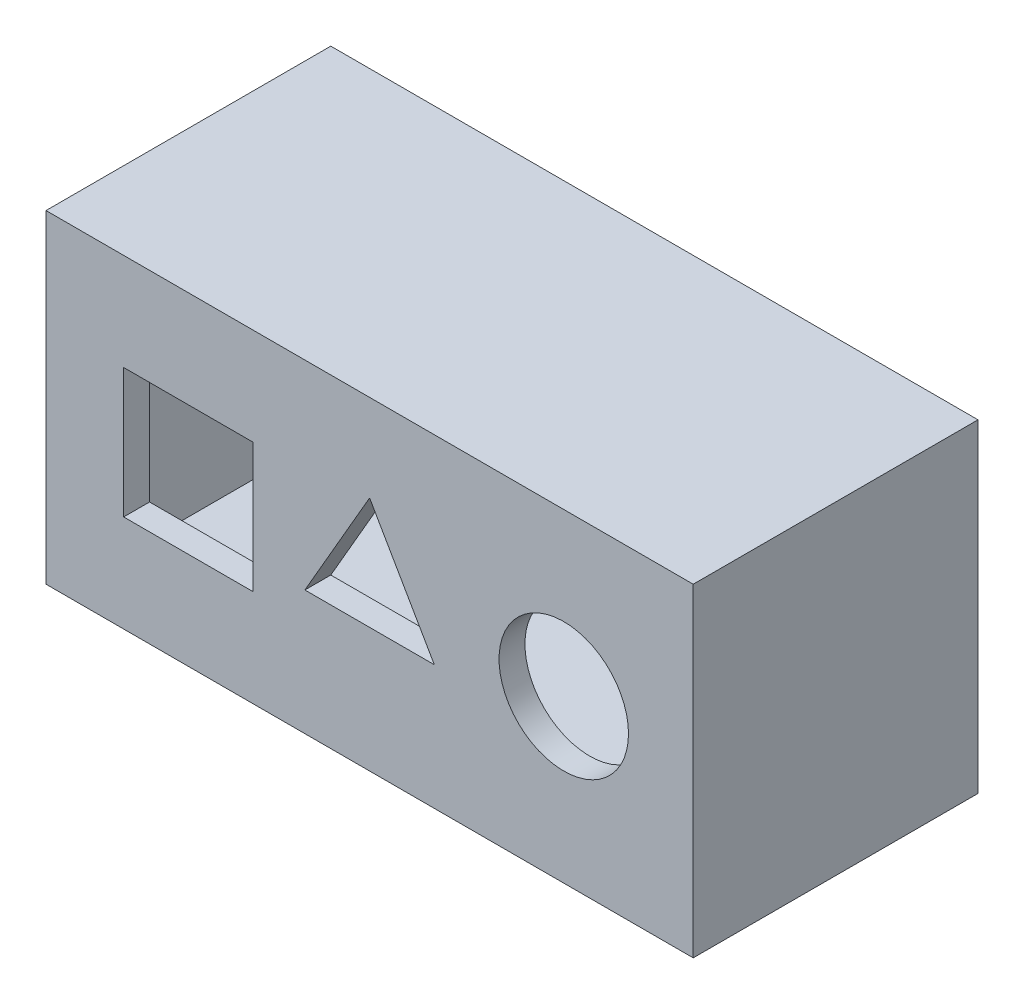
ISO-10303-21;
HEADER;
FILE_DESCRIPTION(('STEP AP214'),'2;1');
FILE_NAME('part.step','',(''),(''),'','','');
FILE_SCHEMA(('AUTOMOTIVE_DESIGN { 1 0 10303 214 1 1 1 1 }'));
ENDSEC;
DATA;
#1=APPLICATION_CONTEXT('core data for automotive mechanical design processes');
#2=APPLICATION_PROTOCOL_DEFINITION('international standard','automotive_design',2000,#1);
#3=PRODUCT_CONTEXT('',#1,'mechanical');
#4=PRODUCT('Part','Part','',(#3));
#5=PRODUCT_RELATED_PRODUCT_CATEGORY('part','',(#4));
#6=PRODUCT_DEFINITION_FORMATION('','',#4);
#7=PRODUCT_DEFINITION_CONTEXT('part definition',#1,'design');
#8=PRODUCT_DEFINITION('design','',#6,#7);
#9=PRODUCT_DEFINITION_SHAPE('','',#8);
#10=(LENGTH_UNIT() NAMED_UNIT(*) SI_UNIT(.MILLI.,.METRE.));
#11=(NAMED_UNIT(*) PLANE_ANGLE_UNIT() SI_UNIT($,.RADIAN.));
#12=(NAMED_UNIT(*) SI_UNIT($,.STERADIAN.) SOLID_ANGLE_UNIT());
#13=UNCERTAINTY_MEASURE_WITH_UNIT(LENGTH_MEASURE(1.E-05),#10,'distance_accuracy_value','');
#14=(GEOMETRIC_REPRESENTATION_CONTEXT(3) GLOBAL_UNCERTAINTY_ASSIGNED_CONTEXT((#13)) GLOBAL_UNIT_ASSIGNED_CONTEXT((#10,
#11,#12)) REPRESENTATION_CONTEXT('',''));
#15=CARTESIAN_POINT('',(0.,0.,0.));
#16=DIRECTION('',(0.,0.,1.));
#17=DIRECTION('',(1.,0.,0.));
#18=AXIS2_PLACEMENT_3D('',#15,#16,#17);
#19=CARTESIAN_POINT('',(0.,0.,0.));
#20=DIRECTION('',(0.,0.,1.));
#21=DIRECTION('',(1.,0.,0.));
#22=AXIS2_PLACEMENT_3D('',#19,#20,#21);
#23=PLANE('',#22);
#24=DIRECTION('',(0.,-1.,0.));
#25=VECTOR('',#24,1.);
#26=CARTESIAN_POINT('',(-125.,-62.5,0.));
#27=LINE('',#26,#25);
#28=CARTESIAN_POINT('',(-125.,62.5,0.));
#29=VERTEX_POINT('',#28);
#30=CARTESIAN_POINT('',(-125.,-62.5,0.));
#31=VERTEX_POINT('',#30);
#32=EDGE_CURVE('E234',#29,#31,#27,.T.);
#33=ORIENTED_EDGE('',*,*,#32,.F.);
#34=DIRECTION('',(-1.,0.,0.));
#35=VECTOR('',#34,1.);
#36=CARTESIAN_POINT('',(125.,62.5,0.));
#37=LINE('',#36,#35);
#38=CARTESIAN_POINT('',(125.,62.5,0.));
#39=VERTEX_POINT('',#38);
#40=EDGE_CURVE('E244',#39,#29,#37,.T.);
#41=ORIENTED_EDGE('',*,*,#40,.F.);
#42=DIRECTION('',(0.,1.,0.));
#43=VECTOR('',#42,1.);
#44=CARTESIAN_POINT('',(125.,-62.5,0.));
#45=LINE('',#44,#43);
#46=CARTESIAN_POINT('',(125.,-62.5,0.));
#47=VERTEX_POINT('',#46);
#48=EDGE_CURVE('E241',#47,#39,#45,.T.);
#49=ORIENTED_EDGE('',*,*,#48,.F.);
#50=DIRECTION('',(1.,0.,0.));
#51=VECTOR('',#50,1.);
#52=CARTESIAN_POINT('',(125.,-62.5,0.));
#53=LINE('',#52,#51);
#54=EDGE_CURVE('E238',#31,#47,#53,.T.);
#55=ORIENTED_EDGE('',*,*,#54,.F.);
#56=EDGE_LOOP('',(#33,#41,#49,#55));
#57=FACE_BOUND('',#56,.T.);
#58=DIRECTION('',(0.,-1.,0.));
#59=VECTOR('',#58,1.);
#60=CARTESIAN_POINT('',(-115.,-57.5,0.));
#61=LINE('',#60,#59);
#62=CARTESIAN_POINT('',(-115.,57.5,0.));
#63=VERTEX_POINT('',#62);
#64=CARTESIAN_POINT('',(-115.,-57.5,0.));
#65=VERTEX_POINT('',#64);
#66=EDGE_CURVE('E67',#63,#65,#61,.T.);
#67=ORIENTED_EDGE('',*,*,#66,.T.);
#68=DIRECTION('',(1.,0.,0.));
#69=VECTOR('',#68,1.);
#70=CARTESIAN_POINT('',(115.,-57.5,0.));
#71=LINE('',#70,#69);
#72=CARTESIAN_POINT('',(115.,-57.5,0.));
#73=VERTEX_POINT('',#72);
#74=EDGE_CURVE('E211',#65,#73,#71,.T.);
#75=ORIENTED_EDGE('',*,*,#74,.T.);
#76=DIRECTION('',(0.,1.,0.));
#77=VECTOR('',#76,1.);
#78=CARTESIAN_POINT('',(115.,-57.5,0.));
#79=LINE('',#78,#77);
#80=CARTESIAN_POINT('',(115.,57.5,0.));
#81=VERTEX_POINT('',#80);
#82=EDGE_CURVE('E216',#73,#81,#79,.T.);
#83=ORIENTED_EDGE('',*,*,#82,.T.);
#84=DIRECTION('',(-1.,0.,0.));
#85=VECTOR('',#84,1.);
#86=CARTESIAN_POINT('',(115.,57.5,0.));
#87=LINE('',#86,#85);
#88=EDGE_CURVE('E198',#81,#63,#87,.T.);
#89=ORIENTED_EDGE('',*,*,#88,.T.);
#90=EDGE_LOOP('',(#67,#75,#83,#89));
#91=FACE_BOUND('',#90,.T.);
#92=ADVANCED_FACE('F43',(#57,#91),#23,.F.);
#93=CARTESIAN_POINT('',(-125.,-62.5,100.));
#94=DIRECTION('',(1.,0.,0.));
#95=DIRECTION('',(0.,0.,-1.));
#96=AXIS2_PLACEMENT_3D('',#93,#94,#95);
#97=PLANE('',#96);
#98=ORIENTED_EDGE('',*,*,#32,.T.);
#99=DIRECTION('',(0.,0.,-1.));
#100=VECTOR('',#99,1.);
#101=CARTESIAN_POINT('',(-125.,-62.5,100.));
#102=LINE('',#101,#100);
#103=CARTESIAN_POINT('',(-125.,-62.5,110.));
#104=VERTEX_POINT('',#103);
#105=EDGE_CURVE('E11',#104,#31,#102,.T.);
#106=ORIENTED_EDGE('',*,*,#105,.F.);
#107=DIRECTION('',(0.,-1.,0.));
#108=VECTOR('',#107,1.);
#109=CARTESIAN_POINT('',(-125.,0.,110.));
#110=LINE('',#109,#108);
#111=CARTESIAN_POINT('',(-125.,62.5,110.));
#112=VERTEX_POINT('',#111);
#113=EDGE_CURVE('E275',#112,#104,#110,.T.);
#114=ORIENTED_EDGE('',*,*,#113,.F.);
#115=DIRECTION('',(0.,0.,-1.));
#116=VECTOR('',#115,1.);
#117=CARTESIAN_POINT('',(-125.,62.5,100.));
#118=LINE('',#117,#116);
#119=EDGE_CURVE('E247',#112,#29,#118,.T.);
#120=ORIENTED_EDGE('',*,*,#119,.T.);
#121=EDGE_LOOP('',(#98,#106,#114,#120));
#122=FACE_BOUND('',#121,.T.);
#123=ADVANCED_FACE('F45',(#122),#97,.F.);
#124=CARTESIAN_POINT('',(125.,-62.5,100.));
#125=DIRECTION('',(0.,1.,0.));
#126=DIRECTION('',(-1.,0.,0.));
#127=AXIS2_PLACEMENT_3D('',#124,#125,#126);
#128=PLANE('',#127);
#129=ORIENTED_EDGE('',*,*,#54,.T.);
#130=DIRECTION('',(0.,0.,-1.));
#131=VECTOR('',#130,1.);
#132=CARTESIAN_POINT('',(125.,-62.5,100.));
#133=LINE('',#132,#131);
#134=CARTESIAN_POINT('',(125.,-62.5,110.));
#135=VERTEX_POINT('',#134);
#136=EDGE_CURVE('E52',#135,#47,#133,.T.);
#137=ORIENTED_EDGE('',*,*,#136,.F.);
#138=DIRECTION('',(1.,0.,0.));
#139=VECTOR('',#138,1.);
#140=CARTESIAN_POINT('',(0.,-62.5,110.));
#141=LINE('',#140,#139);
#142=EDGE_CURVE('E279',#104,#135,#141,.T.);
#143=ORIENTED_EDGE('',*,*,#142,.F.);
#144=ORIENTED_EDGE('',*,*,#105,.T.);
#145=EDGE_LOOP('',(#129,#137,#143,#144));
#146=FACE_BOUND('',#145,.T.);
#147=ADVANCED_FACE('F382',(#146),#128,.F.);
#148=CARTESIAN_POINT('',(125.,-62.5,100.));
#149=DIRECTION('',(-1.,0.,0.));
#150=DIRECTION('',(0.,0.,1.));
#151=AXIS2_PLACEMENT_3D('',#148,#149,#150);
#152=PLANE('',#151);
#153=ORIENTED_EDGE('',*,*,#48,.T.);
#154=DIRECTION('',(0.,0.,-1.));
#155=VECTOR('',#154,1.);
#156=CARTESIAN_POINT('',(125.,62.5,100.));
#157=LINE('',#156,#155);
#158=CARTESIAN_POINT('',(125.,62.5,110.));
#159=VERTEX_POINT('',#158);
#160=EDGE_CURVE('E251',#159,#39,#157,.T.);
#161=ORIENTED_EDGE('',*,*,#160,.F.);
#162=DIRECTION('',(0.,1.,0.));
#163=VECTOR('',#162,1.);
#164=CARTESIAN_POINT('',(125.,0.,110.));
#165=LINE('',#164,#163);
#166=EDGE_CURVE('E261',#135,#159,#165,.T.);
#167=ORIENTED_EDGE('',*,*,#166,.F.);
#168=ORIENTED_EDGE('',*,*,#136,.T.);
#169=EDGE_LOOP('',(#153,#161,#167,#168));
#170=FACE_BOUND('',#169,.T.);
#171=ADVANCED_FACE('F259',(#170),#152,.F.);
#172=CARTESIAN_POINT('',(125.,62.5,100.));
#173=DIRECTION('',(0.,-1.,0.));
#174=DIRECTION('',(1.,0.,0.));
#175=AXIS2_PLACEMENT_3D('',#172,#173,#174);
#176=PLANE('',#175);
#177=ORIENTED_EDGE('',*,*,#40,.T.);
#178=ORIENTED_EDGE('',*,*,#119,.F.);
#179=DIRECTION('',(-1.,0.,0.));
#180=VECTOR('',#179,1.);
#181=CARTESIAN_POINT('',(0.,62.5,110.));
#182=LINE('',#181,#180);
#183=EDGE_CURVE('E280',#159,#112,#182,.T.);
#184=ORIENTED_EDGE('',*,*,#183,.F.);
#185=ORIENTED_EDGE('',*,*,#160,.T.);
#186=EDGE_LOOP('',(#177,#178,#184,#185));
#187=FACE_BOUND('',#186,.T.);
#188=ADVANCED_FACE('F270',(#187),#176,.F.);
#189=CARTESIAN_POINT('',(-115.,-57.5,100.));
#190=DIRECTION('',(1.,0.,0.));
#191=DIRECTION('',(0.,0.,-1.));
#192=AXIS2_PLACEMENT_3D('',#189,#190,#191);
#193=PLANE('',#192);
#194=ORIENTED_EDGE('',*,*,#66,.F.);
#195=DIRECTION('',(0.,0.,-1.));
#196=VECTOR('',#195,1.);
#197=CARTESIAN_POINT('',(-115.,57.5,100.));
#198=LINE('',#197,#196);
#199=CARTESIAN_POINT('',(-115.,57.5,100.));
#200=VERTEX_POINT('',#199);
#201=EDGE_CURVE('E208',#200,#63,#198,.T.);
#202=ORIENTED_EDGE('',*,*,#201,.F.);
#203=DIRECTION('',(0.,-1.,0.));
#204=VECTOR('',#203,1.);
#205=CARTESIAN_POINT('',(-115.,-57.5,100.));
#206=LINE('',#205,#204);
#207=CARTESIAN_POINT('',(-115.,-57.5,100.));
#208=VERTEX_POINT('',#207);
#209=EDGE_CURVE('E193',#200,#208,#206,.T.);
#210=ORIENTED_EDGE('',*,*,#209,.T.);
#211=DIRECTION('',(0.,0.,-1.));
#212=VECTOR('',#211,1.);
#213=CARTESIAN_POINT('',(-115.,-57.5,100.));
#214=LINE('',#213,#212);
#215=EDGE_CURVE('E231',#208,#65,#214,.T.);
#216=ORIENTED_EDGE('',*,*,#215,.T.);
#217=EDGE_LOOP('',(#194,#202,#210,#216));
#218=FACE_BOUND('',#217,.T.);
#219=ADVANCED_FACE('F385',(#218),#193,.T.);
#220=CARTESIAN_POINT('',(115.,-57.5,100.));
#221=DIRECTION('',(0.,1.,0.));
#222=DIRECTION('',(0.,0.,1.));
#223=AXIS2_PLACEMENT_3D('',#220,#221,#222);
#224=PLANE('',#223);
#225=ORIENTED_EDGE('',*,*,#74,.F.);
#226=ORIENTED_EDGE('',*,*,#215,.F.);
#227=DIRECTION('',(1.,0.,0.));
#228=VECTOR('',#227,1.);
#229=CARTESIAN_POINT('',(115.,-57.5,100.));
#230=LINE('',#229,#228);
#231=CARTESIAN_POINT('',(115.,-57.5,100.));
#232=VERTEX_POINT('',#231);
#233=EDGE_CURVE('E197',#208,#232,#230,.T.);
#234=ORIENTED_EDGE('',*,*,#233,.T.);
#235=DIRECTION('',(0.,0.,-1.));
#236=VECTOR('',#235,1.);
#237=CARTESIAN_POINT('',(115.,-57.5,100.));
#238=LINE('',#237,#236);
#239=EDGE_CURVE('E228',#232,#73,#238,.T.);
#240=ORIENTED_EDGE('',*,*,#239,.T.);
#241=EDGE_LOOP('',(#225,#226,#234,#240));
#242=FACE_BOUND('',#241,.T.);
#243=ADVANCED_FACE('F409',(#242),#224,.T.);
#244=CARTESIAN_POINT('',(115.,-57.5,100.));
#245=DIRECTION('',(-1.,0.,0.));
#246=DIRECTION('',(0.,0.,1.));
#247=AXIS2_PLACEMENT_3D('',#244,#245,#246);
#248=PLANE('',#247);
#249=ORIENTED_EDGE('',*,*,#82,.F.);
#250=ORIENTED_EDGE('',*,*,#239,.F.);
#251=DIRECTION('',(0.,1.,0.));
#252=VECTOR('',#251,1.);
#253=CARTESIAN_POINT('',(115.,-57.5,100.));
#254=LINE('',#253,#252);
#255=CARTESIAN_POINT('',(115.,57.5,100.));
#256=VERTEX_POINT('',#255);
#257=EDGE_CURVE('E202',#232,#256,#254,.T.);
#258=ORIENTED_EDGE('',*,*,#257,.T.);
#259=DIRECTION('',(0.,0.,-1.));
#260=VECTOR('',#259,1.);
#261=CARTESIAN_POINT('',(115.,57.5,100.));
#262=LINE('',#261,#260);
#263=EDGE_CURVE('E225',#256,#81,#262,.T.);
#264=ORIENTED_EDGE('',*,*,#263,.T.);
#265=EDGE_LOOP('',(#249,#250,#258,#264));
#266=FACE_BOUND('',#265,.T.);
#267=ADVANCED_FACE('F415',(#266),#248,.T.);
#268=CARTESIAN_POINT('',(115.,57.5,100.));
#269=DIRECTION('',(0.,-1.,0.));
#270=DIRECTION('',(0.,0.,-1.));
#271=AXIS2_PLACEMENT_3D('',#268,#269,#270);
#272=PLANE('',#271);
#273=ORIENTED_EDGE('',*,*,#88,.F.);
#274=ORIENTED_EDGE('',*,*,#263,.F.);
#275=DIRECTION('',(-1.,0.,0.));
#276=VECTOR('',#275,1.);
#277=CARTESIAN_POINT('',(115.,57.5,100.));
#278=LINE('',#277,#276);
#279=EDGE_CURVE('E59',#256,#200,#278,.T.);
#280=ORIENTED_EDGE('',*,*,#279,.T.);
#281=ORIENTED_EDGE('',*,*,#201,.T.);
#282=EDGE_LOOP('',(#273,#274,#280,#281));
#283=FACE_BOUND('',#282,.T.);
#284=ADVANCED_FACE('F422',(#283),#272,.T.);
#285=CARTESIAN_POINT('',(12.5,7.21687836487032,110.));
#286=DIRECTION('',(0.866025403784439,0.5,0.));
#287=DIRECTION('',(-0.5,0.866025403784439,0.));
#288=AXIS2_PLACEMENT_3D('',#285,#286,#287);
#289=PLANE('',#288);
#290=DIRECTION('',(0.5,-0.866025403784439,0.));
#291=VECTOR('',#290,1.);
#292=CARTESIAN_POINT('',(12.5,7.21687836487032,100.));
#293=LINE('',#292,#291);
#294=CARTESIAN_POINT('',(0.,28.8675134594813,100.));
#295=VERTEX_POINT('',#294);
#296=CARTESIAN_POINT('',(25.,-14.4337567297406,100.));
#297=VERTEX_POINT('',#296);
#298=EDGE_CURVE('E312',#295,#297,#293,.T.);
#299=ORIENTED_EDGE('',*,*,#298,.T.);
#300=DIRECTION('',(0.,0.,-1.));
#301=VECTOR('',#300,1.);
#302=CARTESIAN_POINT('',(25.,-14.4337567297406,110.));
#303=LINE('',#302,#301);
#304=CARTESIAN_POINT('',(25.,-14.4337567297406,110.));
#305=VERTEX_POINT('',#304);
#306=EDGE_CURVE('E212',#305,#297,#303,.T.);
#307=ORIENTED_EDGE('',*,*,#306,.F.);
#308=DIRECTION('',(0.5,-0.866025403784439,0.));
#309=VECTOR('',#308,1.);
#310=CARTESIAN_POINT('',(12.5,7.21687836487032,110.));
#311=LINE('',#310,#309);
#312=CARTESIAN_POINT('',(0.,28.8675134594813,110.));
#313=VERTEX_POINT('',#312);
#314=EDGE_CURVE('E349',#313,#305,#311,.T.);
#315=ORIENTED_EDGE('',*,*,#314,.F.);
#316=DIRECTION('',(0.,0.,-1.));
#317=VECTOR('',#316,1.);
#318=CARTESIAN_POINT('',(0.,28.8675134594813,110.));
#319=LINE('',#318,#317);
#320=EDGE_CURVE('E182',#313,#295,#319,.T.);
#321=ORIENTED_EDGE('',*,*,#320,.T.);
#322=EDGE_LOOP('',(#299,#307,#315,#321));
#323=FACE_BOUND('',#322,.T.);
#324=ADVANCED_FACE('F345',(#323),#289,.F.);
#325=CARTESIAN_POINT('',(0.,-14.4337567297406,110.));
#326=DIRECTION('',(0.,-1.,0.));
#327=DIRECTION('',(1.,0.,0.));
#328=AXIS2_PLACEMENT_3D('',#325,#326,#327);
#329=PLANE('',#328);
#330=DIRECTION('',(-1.,0.,0.));
#331=VECTOR('',#330,1.);
#332=CARTESIAN_POINT('',(0.,-14.4337567297406,100.));
#333=LINE('',#332,#331);
#334=CARTESIAN_POINT('',(-25.,-14.4337567297406,100.));
#335=VERTEX_POINT('',#334);
#336=EDGE_CURVE('E316',#297,#335,#333,.T.);
#337=ORIENTED_EDGE('',*,*,#336,.T.);
#338=DIRECTION('',(0.,0.,-1.));
#339=VECTOR('',#338,1.);
#340=CARTESIAN_POINT('',(-25.,-14.4337567297406,110.));
#341=LINE('',#340,#339);
#342=CARTESIAN_POINT('',(-25.,-14.4337567297406,110.));
#343=VERTEX_POINT('',#342);
#344=EDGE_CURVE('E187',#343,#335,#341,.T.);
#345=ORIENTED_EDGE('',*,*,#344,.F.);
#346=DIRECTION('',(-1.,0.,0.));
#347=VECTOR('',#346,1.);
#348=CARTESIAN_POINT('',(0.,-14.4337567297406,110.));
#349=LINE('',#348,#347);
#350=EDGE_CURVE('E286',#305,#343,#349,.T.);
#351=ORIENTED_EDGE('',*,*,#350,.F.);
#352=ORIENTED_EDGE('',*,*,#306,.T.);
#353=EDGE_LOOP('',(#337,#345,#351,#352));
#354=FACE_BOUND('',#353,.T.);
#355=ADVANCED_FACE('F355',(#354),#329,.F.);
#356=CARTESIAN_POINT('',(0.,25.,110.));
#357=DIRECTION('',(0.,1.,0.));
#358=DIRECTION('',(0.,0.,1.));
#359=AXIS2_PLACEMENT_3D('',#356,#357,#358);
#360=PLANE('',#359);
#361=DIRECTION('',(1.,0.,0.));
#362=VECTOR('',#361,1.);
#363=CARTESIAN_POINT('',(0.,25.,100.));
#364=LINE('',#363,#362);
#365=CARTESIAN_POINT('',(-95.,25.,100.));
#366=VERTEX_POINT('',#365);
#367=CARTESIAN_POINT('',(-45.,25.,100.));
#368=VERTEX_POINT('',#367);
#369=EDGE_CURVE('E180',#366,#368,#364,.T.);
#370=ORIENTED_EDGE('',*,*,#369,.T.);
#371=DIRECTION('',(0.,0.,-1.));
#372=VECTOR('',#371,1.);
#373=CARTESIAN_POINT('',(-45.,25.,110.));
#374=LINE('',#373,#372);
#375=CARTESIAN_POINT('',(-45.,25.,110.));
#376=VERTEX_POINT('',#375);
#377=EDGE_CURVE('E158',#376,#368,#374,.T.);
#378=ORIENTED_EDGE('',*,*,#377,.F.);
#379=DIRECTION('',(1.,0.,0.));
#380=VECTOR('',#379,1.);
#381=CARTESIAN_POINT('',(0.,25.,110.));
#382=LINE('',#381,#380);
#383=CARTESIAN_POINT('',(-95.,25.,110.));
#384=VERTEX_POINT('',#383);
#385=EDGE_CURVE('E166',#384,#376,#382,.T.);
#386=ORIENTED_EDGE('',*,*,#385,.F.);
#387=DIRECTION('',(0.,0.,-1.));
#388=VECTOR('',#387,1.);
#389=CARTESIAN_POINT('',(-95.,25.,110.));
#390=LINE('',#389,#388);
#391=EDGE_CURVE('E294',#384,#366,#390,.T.);
#392=ORIENTED_EDGE('',*,*,#391,.T.);
#393=EDGE_LOOP('',(#370,#378,#386,#392));
#394=FACE_BOUND('',#393,.T.);
#395=ADVANCED_FACE('F178',(#394),#360,.F.);
#396=CARTESIAN_POINT('',(-45.,0.,110.));
#397=DIRECTION('',(1.,0.,0.));
#398=DIRECTION('',(0.,1.,0.));
#399=AXIS2_PLACEMENT_3D('',#396,#397,#398);
#400=PLANE('',#399);
#401=DIRECTION('',(0.,-1.,0.));
#402=VECTOR('',#401,1.);
#403=CARTESIAN_POINT('',(-45.,0.,100.));
#404=LINE('',#403,#402);
#405=CARTESIAN_POINT('',(-45.,-25.,100.));
#406=VERTEX_POINT('',#405);
#407=EDGE_CURVE('E301',#368,#406,#404,.T.);
#408=ORIENTED_EDGE('',*,*,#407,.T.);
#409=DIRECTION('',(0.,0.,-1.));
#410=VECTOR('',#409,1.);
#411=CARTESIAN_POINT('',(-45.,-25.,110.));
#412=LINE('',#411,#410);
#413=CARTESIAN_POINT('',(-45.,-25.,110.));
#414=VERTEX_POINT('',#413);
#415=EDGE_CURVE('E160',#414,#406,#412,.T.);
#416=ORIENTED_EDGE('',*,*,#415,.F.);
#417=DIRECTION('',(0.,-1.,0.));
#418=VECTOR('',#417,1.);
#419=CARTESIAN_POINT('',(-45.,0.,110.));
#420=LINE('',#419,#418);
#421=EDGE_CURVE('E153',#376,#414,#420,.T.);
#422=ORIENTED_EDGE('',*,*,#421,.F.);
#423=ORIENTED_EDGE('',*,*,#377,.T.);
#424=EDGE_LOOP('',(#408,#416,#422,#423));
#425=FACE_BOUND('',#424,.T.);
#426=ADVANCED_FACE('F156',(#425),#400,.F.);
#427=CARTESIAN_POINT('',(0.,-25.,110.));
#428=DIRECTION('',(0.,1.,0.));
#429=DIRECTION('',(0.,0.,1.));
#430=AXIS2_PLACEMENT_3D('',#427,#428,#429);
#431=PLANE('',#430);
#432=DIRECTION('',(1.,0.,0.));
#433=VECTOR('',#432,1.);
#434=CARTESIAN_POINT('',(0.,-25.,100.));
#435=LINE('',#434,#433);
#436=CARTESIAN_POINT('',(-95.,-25.,100.));
#437=VERTEX_POINT('',#436);
#438=EDGE_CURVE('E304',#437,#406,#435,.T.);
#439=ORIENTED_EDGE('',*,*,#438,.F.);
#440=DIRECTION('',(0.,0.,-1.));
#441=VECTOR('',#440,1.);
#442=CARTESIAN_POINT('',(-95.,-25.,110.));
#443=LINE('',#442,#441);
#444=CARTESIAN_POINT('',(-95.,-25.,110.));
#445=VERTEX_POINT('',#444);
#446=EDGE_CURVE('E189',#445,#437,#443,.T.);
#447=ORIENTED_EDGE('',*,*,#446,.F.);
#448=DIRECTION('',(1.,0.,0.));
#449=VECTOR('',#448,1.);
#450=CARTESIAN_POINT('',(0.,-25.,110.));
#451=LINE('',#450,#449);
#452=EDGE_CURVE('E165',#445,#414,#451,.T.);
#453=ORIENTED_EDGE('',*,*,#452,.T.);
#454=ORIENTED_EDGE('',*,*,#415,.T.);
#455=EDGE_LOOP('',(#439,#447,#453,#454));
#456=FACE_BOUND('',#455,.T.);
#457=ADVANCED_FACE('F335',(#456),#431,.T.);
#458=CARTESIAN_POINT('',(-12.5,7.21687836487033,110.));
#459=DIRECTION('',(-0.866025403784439,0.5,0.));
#460=DIRECTION('',(-0.5,-0.866025403784439,0.));
#461=AXIS2_PLACEMENT_3D('',#458,#459,#460);
#462=PLANE('',#461);
#463=DIRECTION('',(0.5,0.866025403784439,0.));
#464=VECTOR('',#463,1.);
#465=CARTESIAN_POINT('',(-12.5,7.21687836487033,100.));
#466=LINE('',#465,#464);
#467=EDGE_CURVE('E319',#335,#295,#466,.T.);
#468=ORIENTED_EDGE('',*,*,#467,.T.);
#469=ORIENTED_EDGE('',*,*,#320,.F.);
#470=DIRECTION('',(0.5,0.866025403784439,0.));
#471=VECTOR('',#470,1.);
#472=CARTESIAN_POINT('',(-12.5,7.21687836487033,110.));
#473=LINE('',#472,#471);
#474=EDGE_CURVE('E283',#343,#313,#473,.T.);
#475=ORIENTED_EDGE('',*,*,#474,.F.);
#476=ORIENTED_EDGE('',*,*,#344,.T.);
#477=EDGE_LOOP('',(#468,#469,#475,#476));
#478=FACE_BOUND('',#477,.T.);
#479=ADVANCED_FACE('F352',(#478),#462,.F.);
#480=CARTESIAN_POINT('',(-95.,0.,110.));
#481=DIRECTION('',(1.,0.,0.));
#482=DIRECTION('',(0.,0.,-1.));
#483=AXIS2_PLACEMENT_3D('',#480,#481,#482);
#484=PLANE('',#483);
#485=DIRECTION('',(0.,-1.,0.));
#486=VECTOR('',#485,1.);
#487=CARTESIAN_POINT('',(-95.,0.,100.));
#488=LINE('',#487,#486);
#489=EDGE_CURVE('E308',#366,#437,#488,.T.);
#490=ORIENTED_EDGE('',*,*,#489,.F.);
#491=ORIENTED_EDGE('',*,*,#391,.F.);
#492=DIRECTION('',(0.,-1.,0.));
#493=VECTOR('',#492,1.);
#494=CARTESIAN_POINT('',(-95.,0.,110.));
#495=LINE('',#494,#493);
#496=EDGE_CURVE('E173',#384,#445,#495,.T.);
#497=ORIENTED_EDGE('',*,*,#496,.T.);
#498=ORIENTED_EDGE('',*,*,#446,.T.);
#499=EDGE_LOOP('',(#490,#491,#497,#498));
#500=FACE_BOUND('',#499,.T.);
#501=ADVANCED_FACE('F333',(#500),#484,.T.);
#502=CARTESIAN_POINT('',(74.9999999999999,0.,110.));
#503=DIRECTION('',(0.,0.,-1.));
#504=DIRECTION('',(-1.,0.,0.));
#505=AXIS2_PLACEMENT_3D('',#502,#503,#504);
#506=CYLINDRICAL_SURFACE('',#505,25.);
#507=CARTESIAN_POINT('',(74.9999999999999,0.,110.));
#508=DIRECTION('',(0.,0.,1.));
#509=DIRECTION('',(1.,0.,0.));
#510=AXIS2_PLACEMENT_3D('',#507,#508,#509);
#511=CIRCLE('',#510,25.);
#512=CARTESIAN_POINT('',(99.9999999999999,0.,110.));
#513=VERTEX_POINT('',#512);
#514=EDGE_CURVE('E176',#513,#513,#511,.T.);
#515=ORIENTED_EDGE('',*,*,#514,.T.);
#516=EDGE_LOOP('',(#515));
#517=FACE_BOUND('',#516,.T.);
#518=CARTESIAN_POINT('',(74.9999999999999,0.,100.));
#519=DIRECTION('',(0.,0.,1.));
#520=DIRECTION('',(1.,0.,0.));
#521=AXIS2_PLACEMENT_3D('',#518,#519,#520);
#522=CIRCLE('',#521,25.);
#523=CARTESIAN_POINT('',(99.9999999999999,0.,100.));
#524=VERTEX_POINT('',#523);
#525=EDGE_CURVE('E295',#524,#524,#522,.T.);
#526=ORIENTED_EDGE('',*,*,#525,.F.);
#527=EDGE_LOOP('',(#526));
#528=FACE_BOUND('',#527,.T.);
#529=ADVANCED_FACE('F368',(#517,#528),#506,.F.);
#530=CARTESIAN_POINT('',(0.,0.,110.));
#531=DIRECTION('',(0.,0.,1.));
#532=DIRECTION('',(1.,0.,0.));
#533=AXIS2_PLACEMENT_3D('',#530,#531,#532);
#534=PLANE('',#533);
#535=ORIENTED_EDGE('',*,*,#514,.F.);
#536=EDGE_LOOP('',(#535));
#537=FACE_BOUND('',#536,.T.);
#538=ORIENTED_EDGE('',*,*,#385,.T.);
#539=ORIENTED_EDGE('',*,*,#421,.T.);
#540=ORIENTED_EDGE('',*,*,#452,.F.);
#541=ORIENTED_EDGE('',*,*,#496,.F.);
#542=EDGE_LOOP('',(#538,#539,#540,#541));
#543=FACE_BOUND('',#542,.T.);
#544=ORIENTED_EDGE('',*,*,#314,.T.);
#545=ORIENTED_EDGE('',*,*,#350,.T.);
#546=ORIENTED_EDGE('',*,*,#474,.T.);
#547=EDGE_LOOP('',(#544,#545,#546));
#548=FACE_BOUND('',#547,.T.);
#549=ORIENTED_EDGE('',*,*,#183,.T.);
#550=ORIENTED_EDGE('',*,*,#113,.T.);
#551=ORIENTED_EDGE('',*,*,#142,.T.);
#552=ORIENTED_EDGE('',*,*,#166,.T.);
#553=EDGE_LOOP('',(#549,#550,#551,#552));
#554=FACE_BOUND('',#553,.T.);
#555=ADVANCED_FACE('F170',(#537,#543,#548,#554),#534,.T.);
#556=CARTESIAN_POINT('',(0.,0.,100.));
#557=DIRECTION('',(0.,0.,1.));
#558=DIRECTION('',(1.,0.,0.));
#559=AXIS2_PLACEMENT_3D('',#556,#557,#558);
#560=PLANE('',#559);
#561=ORIENTED_EDGE('',*,*,#233,.F.);
#562=ORIENTED_EDGE('',*,*,#209,.F.);
#563=ORIENTED_EDGE('',*,*,#279,.F.);
#564=ORIENTED_EDGE('',*,*,#257,.F.);
#565=EDGE_LOOP('',(#561,#562,#563,#564));
#566=FACE_BOUND('',#565,.T.);
#567=ORIENTED_EDGE('',*,*,#525,.T.);
#568=EDGE_LOOP('',(#567));
#569=FACE_BOUND('',#568,.T.);
#570=ORIENTED_EDGE('',*,*,#369,.F.);
#571=ORIENTED_EDGE('',*,*,#489,.T.);
#572=ORIENTED_EDGE('',*,*,#438,.T.);
#573=ORIENTED_EDGE('',*,*,#407,.F.);
#574=EDGE_LOOP('',(#570,#571,#572,#573));
#575=FACE_BOUND('',#574,.T.);
#576=ORIENTED_EDGE('',*,*,#298,.F.);
#577=ORIENTED_EDGE('',*,*,#467,.F.);
#578=ORIENTED_EDGE('',*,*,#336,.F.);
#579=EDGE_LOOP('',(#576,#577,#578));
#580=FACE_BOUND('',#579,.T.);
#581=ADVANCED_FACE('F337',(#566,#569,#575,#580),#560,.F.);
#582=CLOSED_SHELL('',(#92,#123,#147,#171,#188,#219,#243,#267,#284,#324,#355,#395,#426,#457,#479,
#501,#529,#555,#581));
#583=MANIFOLD_SOLID_BREP('B2',#582);
#584=ADVANCED_BREP_SHAPE_REPRESENTATION('',(#18,#583),#14);
#585=SHAPE_DEFINITION_REPRESENTATION(#9,#584);
ENDSEC;
END-ISO-10303-21;
